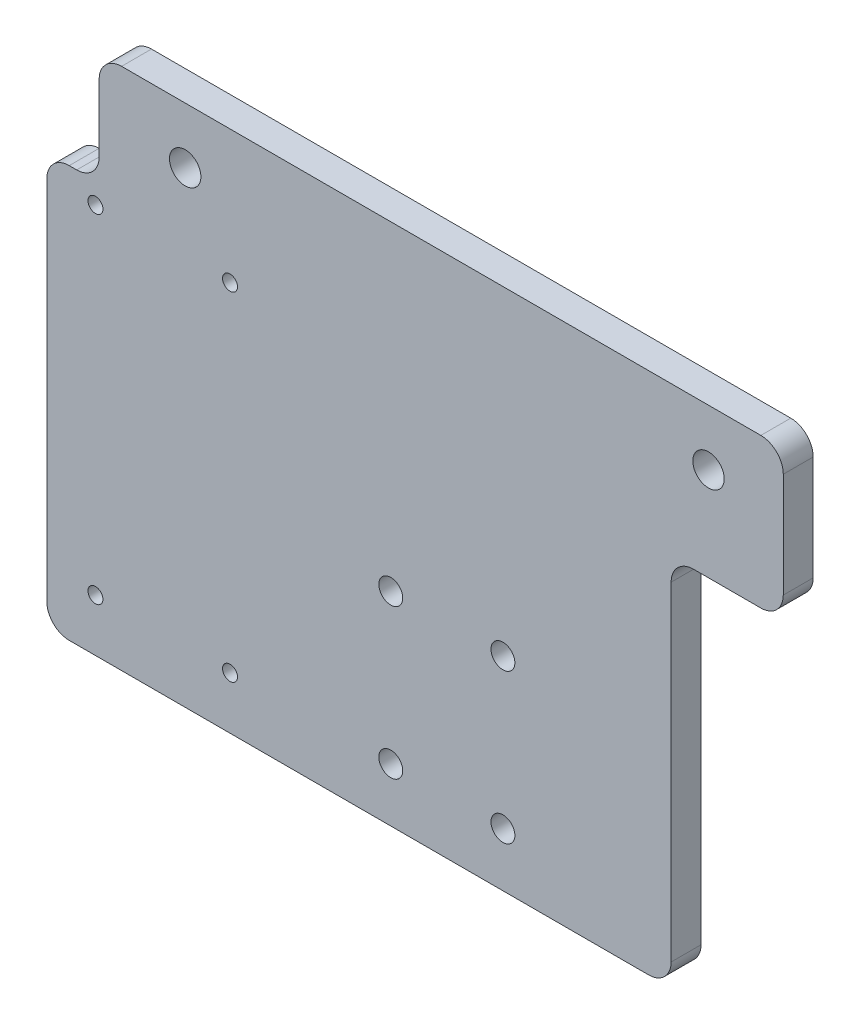
ISO-10303-21;
HEADER;
FILE_DESCRIPTION(('STEP AP214'),'2;1');
FILE_NAME('part.step','',(''),(''),'','','');
FILE_SCHEMA(('AUTOMOTIVE_DESIGN { 1 0 10303 214 1 1 1 1 }'));
ENDSEC;
DATA;
#1=APPLICATION_CONTEXT('core data for automotive mechanical design processes');
#2=APPLICATION_PROTOCOL_DEFINITION('international standard','automotive_design',2000,#1);
#3=PRODUCT_CONTEXT('',#1,'mechanical');
#4=PRODUCT('Part','Part','',(#3));
#5=PRODUCT_RELATED_PRODUCT_CATEGORY('part','',(#4));
#6=PRODUCT_DEFINITION_FORMATION('','',#4);
#7=PRODUCT_DEFINITION_CONTEXT('part definition',#1,'design');
#8=PRODUCT_DEFINITION('design','',#6,#7);
#9=PRODUCT_DEFINITION_SHAPE('','',#8);
#10=(LENGTH_UNIT() NAMED_UNIT(*) SI_UNIT(.MILLI.,.METRE.));
#11=(NAMED_UNIT(*) PLANE_ANGLE_UNIT() SI_UNIT($,.RADIAN.));
#12=(NAMED_UNIT(*) SI_UNIT($,.STERADIAN.) SOLID_ANGLE_UNIT());
#13=UNCERTAINTY_MEASURE_WITH_UNIT(LENGTH_MEASURE(1.E-05),#10,'distance_accuracy_value','');
#14=(GEOMETRIC_REPRESENTATION_CONTEXT(3) GLOBAL_UNCERTAINTY_ASSIGNED_CONTEXT((#13)) GLOBAL_UNIT_ASSIGNED_CONTEXT((#10,
#11,#12)) REPRESENTATION_CONTEXT('',''));
#15=CARTESIAN_POINT('',(0.,0.,0.));
#16=DIRECTION('',(0.,0.,1.));
#17=DIRECTION('',(1.,0.,0.));
#18=AXIS2_PLACEMENT_3D('',#15,#16,#17);
#19=CARTESIAN_POINT('',(0.,0.,4.));
#20=DIRECTION('',(0.,0.,1.));
#21=DIRECTION('',(1.,0.,0.));
#22=AXIS2_PLACEMENT_3D('',#19,#20,#21);
#23=PLANE('',#22);
#24=CARTESIAN_POINT('',(7.50000000000021,22.2,4.));
#25=DIRECTION('',(0.,0.,1.));
#26=DIRECTION('',(1.,0.,0.));
#27=AXIS2_PLACEMENT_3D('',#24,#25,#26);
#28=CIRCLE('',#27,1.6);
#29=CARTESIAN_POINT('',(9.10000000000021,22.2,4.));
#30=VERTEX_POINT('',#29);
#31=EDGE_CURVE('E500',#30,#30,#28,.F.);
#32=ORIENTED_EDGE('',*,*,#31,.T.);
#33=EDGE_LOOP('',(#32));
#34=FACE_BOUND('',#33,.T.);
#35=CARTESIAN_POINT('',(-7.5,42.2,4.));
#36=DIRECTION('',(0.,0.,1.));
#37=DIRECTION('',(1.,0.,0.));
#38=AXIS2_PLACEMENT_3D('',#35,#36,#37);
#39=CIRCLE('',#38,1.60000000000001);
#40=CARTESIAN_POINT('',(-5.89999999999999,42.2,4.));
#41=VERTEX_POINT('',#40);
#42=EDGE_CURVE('E207',#41,#41,#39,.T.);
#43=ORIENTED_EDGE('',*,*,#42,.F.);
#44=EDGE_LOOP('',(#43));
#45=FACE_BOUND('',#44,.T.);
#46=DIRECTION('',(1.,0.,0.));
#47=VECTOR('',#46,1.);
#48=CARTESIAN_POINT('',(0.,70.,4.));
#49=LINE('',#48,#47);
#50=CARTESIAN_POINT('',(-50.5071624673069,70.,4.));
#51=VERTEX_POINT('',#50);
#52=CARTESIAN_POINT('',(-49.5071624673069,70.,4.));
#53=VERTEX_POINT('',#52);
#54=EDGE_CURVE('E187',#51,#53,#49,.T.);
#55=ORIENTED_EDGE('',*,*,#54,.F.);
#56=CARTESIAN_POINT('',(-50.5071624673069,67.,4.));
#57=DIRECTION('',(0.,0.,1.));
#58=DIRECTION('',(1.,0.,0.));
#59=AXIS2_PLACEMENT_3D('',#56,#57,#58);
#60=CIRCLE('',#59,3.);
#61=CARTESIAN_POINT('',(-53.5071624673069,67.,4.));
#62=VERTEX_POINT('',#61);
#63=EDGE_CURVE('E170',#51,#62,#60,.T.);
#64=ORIENTED_EDGE('',*,*,#63,.T.);
#65=DIRECTION('',(0.,1.,0.));
#66=VECTOR('',#65,1.);
#67=CARTESIAN_POINT('',(-53.5071624673069,0.,4.));
#68=LINE('',#67,#66);
#69=CARTESIAN_POINT('',(-53.5071624673069,18.,4.));
#70=VERTEX_POINT('',#69);
#71=EDGE_CURVE('E201',#70,#62,#68,.T.);
#72=ORIENTED_EDGE('',*,*,#71,.F.);
#73=CARTESIAN_POINT('',(-50.5071624673069,18.,4.));
#74=DIRECTION('',(0.,0.,1.));
#75=DIRECTION('',(1.,0.,0.));
#76=AXIS2_PLACEMENT_3D('',#73,#74,#75);
#77=CIRCLE('',#76,3.);
#78=CARTESIAN_POINT('',(-50.5071624673069,15.,4.));
#79=VERTEX_POINT('',#78);
#80=EDGE_CURVE('E281',#70,#79,#77,.T.);
#81=ORIENTED_EDGE('',*,*,#80,.T.);
#82=DIRECTION('',(-1.,0.,0.));
#83=VECTOR('',#82,1.);
#84=CARTESIAN_POINT('',(0.,15.,4.));
#85=LINE('',#84,#83);
#86=CARTESIAN_POINT('',(27.,15.,4.));
#87=VERTEX_POINT('',#86);
#88=EDGE_CURVE('E224',#87,#79,#85,.T.);
#89=ORIENTED_EDGE('',*,*,#88,.F.);
#90=CARTESIAN_POINT('',(27.,18.,4.));
#91=DIRECTION('',(0.,0.,1.));
#92=DIRECTION('',(1.,0.,0.));
#93=AXIS2_PLACEMENT_3D('',#90,#91,#92);
#94=CIRCLE('',#93,3.);
#95=CARTESIAN_POINT('',(30.,18.,4.));
#96=VERTEX_POINT('',#95);
#97=EDGE_CURVE('E191',#87,#96,#94,.T.);
#98=ORIENTED_EDGE('',*,*,#97,.T.);
#99=DIRECTION('',(0.,1.,0.));
#100=VECTOR('',#99,1.);
#101=CARTESIAN_POINT('',(30.,0.,4.));
#102=LINE('',#101,#100);
#103=CARTESIAN_POINT('',(30.,62.,4.));
#104=VERTEX_POINT('',#103);
#105=EDGE_CURVE('E204',#96,#104,#102,.T.);
#106=ORIENTED_EDGE('',*,*,#105,.T.);
#107=CARTESIAN_POINT('',(33.,62.,4.));
#108=DIRECTION('',(0.,0.,1.));
#109=DIRECTION('',(1.,0.,0.));
#110=AXIS2_PLACEMENT_3D('',#107,#108,#109);
#111=CIRCLE('',#110,3.);
#112=CARTESIAN_POINT('',(33.,65.,4.));
#113=VERTEX_POINT('',#112);
#114=EDGE_CURVE('E334',#104,#113,#111,.F.);
#115=ORIENTED_EDGE('',*,*,#114,.T.);
#116=DIRECTION('',(-1.,0.,0.));
#117=VECTOR('',#116,1.);
#118=CARTESIAN_POINT('',(0.,65.,4.));
#119=LINE('',#118,#117);
#120=CARTESIAN_POINT('',(42.,65.,4.));
#121=VERTEX_POINT('',#120);
#122=EDGE_CURVE('E198',#121,#113,#119,.T.);
#123=ORIENTED_EDGE('',*,*,#122,.F.);
#124=CARTESIAN_POINT('',(42.,68.,4.));
#125=DIRECTION('',(0.,0.,1.));
#126=DIRECTION('',(1.,0.,0.));
#127=AXIS2_PLACEMENT_3D('',#124,#125,#126);
#128=CIRCLE('',#127,3.);
#129=CARTESIAN_POINT('',(45.,68.,4.));
#130=VERTEX_POINT('',#129);
#131=EDGE_CURVE('E283',#121,#130,#128,.T.);
#132=ORIENTED_EDGE('',*,*,#131,.T.);
#133=DIRECTION('',(0.,-1.,0.));
#134=VECTOR('',#133,1.);
#135=CARTESIAN_POINT('',(45.,67.,4.));
#136=LINE('',#135,#134);
#137=CARTESIAN_POINT('',(45.,82.,4.));
#138=VERTEX_POINT('',#137);
#139=EDGE_CURVE('E243',#138,#130,#136,.T.);
#140=ORIENTED_EDGE('',*,*,#139,.F.);
#141=CARTESIAN_POINT('',(42.,82.,4.));
#142=DIRECTION('',(0.,0.,1.));
#143=DIRECTION('',(1.,0.,0.));
#144=AXIS2_PLACEMENT_3D('',#141,#142,#143);
#145=CIRCLE('',#144,3.);
#146=CARTESIAN_POINT('',(42.,85.,4.));
#147=VERTEX_POINT('',#146);
#148=EDGE_CURVE('E285',#138,#147,#145,.T.);
#149=ORIENTED_EDGE('',*,*,#148,.T.);
#150=DIRECTION('',(1.,0.,0.));
#151=VECTOR('',#150,1.);
#152=CARTESIAN_POINT('',(0.,85.,4.));
#153=LINE('',#152,#151);
#154=CARTESIAN_POINT('',(-43.5071624673069,85.,4.));
#155=VERTEX_POINT('',#154);
#156=EDGE_CURVE('E246',#155,#147,#153,.T.);
#157=ORIENTED_EDGE('',*,*,#156,.F.);
#158=CARTESIAN_POINT('',(-43.5071624673069,82.,4.));
#159=DIRECTION('',(0.,0.,1.));
#160=DIRECTION('',(1.,0.,0.));
#161=AXIS2_PLACEMENT_3D('',#158,#159,#160);
#162=CIRCLE('',#161,3.);
#163=CARTESIAN_POINT('',(-46.5071624673069,82.,4.));
#164=VERTEX_POINT('',#163);
#165=EDGE_CURVE('E181',#155,#164,#162,.T.);
#166=ORIENTED_EDGE('',*,*,#165,.T.);
#167=DIRECTION('',(0.,1.,0.));
#168=VECTOR('',#167,1.);
#169=CARTESIAN_POINT('',(-46.5071624673069,0.,4.));
#170=LINE('',#169,#168);
#171=CARTESIAN_POINT('',(-46.5071624673069,73.,4.));
#172=VERTEX_POINT('',#171);
#173=EDGE_CURVE('E197',#172,#164,#170,.T.);
#174=ORIENTED_EDGE('',*,*,#173,.F.);
#175=CARTESIAN_POINT('',(-49.5071624673069,73.,4.));
#176=DIRECTION('',(0.,0.,1.));
#177=DIRECTION('',(1.,0.,0.));
#178=AXIS2_PLACEMENT_3D('',#175,#176,#177);
#179=CIRCLE('',#178,3.);
#180=EDGE_CURVE('E196',#172,#53,#179,.F.);
#181=ORIENTED_EDGE('',*,*,#180,.T.);
#182=EDGE_LOOP('',(#55,#64,#72,#81,#89,#98,#106,#115,#123,#132,#140,#149,#157,#166,#174,#181));
#183=FACE_BOUND('',#182,.T.);
#184=CARTESIAN_POINT('',(-29.,22.,4.));
#185=DIRECTION('',(0.,0.,1.));
#186=DIRECTION('',(1.,0.,0.));
#187=AXIS2_PLACEMENT_3D('',#184,#185,#186);
#188=CIRCLE('',#187,0.999999999999998);
#189=CARTESIAN_POINT('',(-28.,22.,4.));
#190=VERTEX_POINT('',#189);
#191=EDGE_CURVE('E234',#190,#190,#188,.T.);
#192=ORIENTED_EDGE('',*,*,#191,.F.);
#193=EDGE_LOOP('',(#192));
#194=FACE_BOUND('',#193,.T.);
#195=CARTESIAN_POINT('',(-47.0000000000001,67.2,4.));
#196=DIRECTION('',(0.,0.,1.));
#197=DIRECTION('',(1.,0.,0.));
#198=AXIS2_PLACEMENT_3D('',#195,#196,#197);
#199=CIRCLE('',#198,0.999999999999998);
#200=CARTESIAN_POINT('',(-46.0000000000001,67.2,4.));
#201=VERTEX_POINT('',#200);
#202=EDGE_CURVE('E233',#201,#201,#199,.T.);
#203=ORIENTED_EDGE('',*,*,#202,.F.);
#204=EDGE_LOOP('',(#203));
#205=FACE_BOUND('',#204,.T.);
#206=CARTESIAN_POINT('',(-29.0000000000001,67.2,4.));
#207=DIRECTION('',(0.,0.,1.));
#208=DIRECTION('',(1.,0.,0.));
#209=AXIS2_PLACEMENT_3D('',#206,#207,#208);
#210=CIRCLE('',#209,0.999999999999998);
#211=CARTESIAN_POINT('',(-28.0000000000001,67.2,4.));
#212=VERTEX_POINT('',#211);
#213=EDGE_CURVE('E230',#212,#212,#210,.T.);
#214=ORIENTED_EDGE('',*,*,#213,.F.);
#215=EDGE_LOOP('',(#214));
#216=FACE_BOUND('',#215,.T.);
#217=CARTESIAN_POINT('',(-47.,22.,4.));
#218=DIRECTION('',(0.,0.,1.));
#219=DIRECTION('',(1.,0.,0.));
#220=AXIS2_PLACEMENT_3D('',#217,#218,#219);
#221=CIRCLE('',#220,0.999999999999998);
#222=CARTESIAN_POINT('',(-46.,22.,4.));
#223=VERTEX_POINT('',#222);
#224=EDGE_CURVE('E237',#223,#223,#221,.T.);
#225=ORIENTED_EDGE('',*,*,#224,.F.);
#226=EDGE_LOOP('',(#225));
#227=FACE_BOUND('',#226,.T.);
#228=CARTESIAN_POINT('',(-34.9999999999999,77.5,4.));
#229=DIRECTION('',(0.,0.,1.));
#230=DIRECTION('',(1.,0.,0.));
#231=AXIS2_PLACEMENT_3D('',#228,#229,#230);
#232=CIRCLE('',#231,2.1);
#233=CARTESIAN_POINT('',(-32.8999999999999,77.5,4.));
#234=VERTEX_POINT('',#233);
#235=EDGE_CURVE('E263',#234,#234,#232,.T.);
#236=ORIENTED_EDGE('',*,*,#235,.F.);
#237=EDGE_LOOP('',(#236));
#238=FACE_BOUND('',#237,.T.);
#239=CARTESIAN_POINT('',(35.0000000000001,77.5,4.));
#240=DIRECTION('',(0.,0.,1.));
#241=DIRECTION('',(1.,0.,0.));
#242=AXIS2_PLACEMENT_3D('',#239,#240,#241);
#243=CIRCLE('',#242,2.10000000000001);
#244=CARTESIAN_POINT('',(37.1000000000001,77.5,4.));
#245=VERTEX_POINT('',#244);
#246=EDGE_CURVE('E255',#245,#245,#243,.F.);
#247=ORIENTED_EDGE('',*,*,#246,.T.);
#248=EDGE_LOOP('',(#247));
#249=FACE_BOUND('',#248,.T.);
#250=CARTESIAN_POINT('',(-7.49999999999979,22.2,4.));
#251=DIRECTION('',(0.,0.,1.));
#252=DIRECTION('',(1.,0.,0.));
#253=AXIS2_PLACEMENT_3D('',#250,#251,#252);
#254=CIRCLE('',#253,1.6);
#255=CARTESIAN_POINT('',(-5.89999999999978,22.2,4.));
#256=VERTEX_POINT('',#255);
#257=EDGE_CURVE('E494',#256,#256,#254,.T.);
#258=ORIENTED_EDGE('',*,*,#257,.F.);
#259=EDGE_LOOP('',(#258));
#260=FACE_BOUND('',#259,.T.);
#261=CARTESIAN_POINT('',(7.5,42.2,4.));
#262=DIRECTION('',(0.,0.,1.));
#263=DIRECTION('',(1.,0.,0.));
#264=AXIS2_PLACEMENT_3D('',#261,#262,#263);
#265=CIRCLE('',#264,1.6);
#266=CARTESIAN_POINT('',(9.10000000000001,42.2,4.));
#267=VERTEX_POINT('',#266);
#268=EDGE_CURVE('E497',#267,#267,#265,.F.);
#269=ORIENTED_EDGE('',*,*,#268,.T.);
#270=EDGE_LOOP('',(#269));
#271=FACE_BOUND('',#270,.T.);
#272=ADVANCED_FACE('F53',(#34,#45,#183,#194,#205,#216,#227,#238,#249,#260,#271),#23,.T.);
#273=CARTESIAN_POINT('',(0.,0.,0.));
#274=DIRECTION('',(0.,0.,1.));
#275=DIRECTION('',(1.,0.,0.));
#276=AXIS2_PLACEMENT_3D('',#273,#274,#275);
#277=PLANE('',#276);
#278=CARTESIAN_POINT('',(-7.5,42.2,0.));
#279=DIRECTION('',(0.,0.,1.));
#280=DIRECTION('',(1.,0.,0.));
#281=AXIS2_PLACEMENT_3D('',#278,#279,#280);
#282=CIRCLE('',#281,2.60000000000001);
#283=CARTESIAN_POINT('',(-4.89999999999999,42.2,0.));
#284=VERTEX_POINT('',#283);
#285=EDGE_CURVE('E62',#284,#284,#282,.T.);
#286=ORIENTED_EDGE('',*,*,#285,.T.);
#287=EDGE_LOOP('',(#286));
#288=FACE_BOUND('',#287,.T.);
#289=CARTESIAN_POINT('',(-7.49999999999979,22.2,0.));
#290=DIRECTION('',(0.,0.,1.));
#291=DIRECTION('',(1.,0.,0.));
#292=AXIS2_PLACEMENT_3D('',#289,#290,#291);
#293=CIRCLE('',#292,1.6);
#294=CARTESIAN_POINT('',(-5.89999999999978,22.2,0.));
#295=VERTEX_POINT('',#294);
#296=EDGE_CURVE('E340',#295,#295,#293,.T.);
#297=ORIENTED_EDGE('',*,*,#296,.T.);
#298=EDGE_LOOP('',(#297));
#299=FACE_BOUND('',#298,.T.);
#300=CARTESIAN_POINT('',(35.0000000000001,77.5,0.));
#301=DIRECTION('',(0.,0.,1.));
#302=DIRECTION('',(1.,0.,0.));
#303=AXIS2_PLACEMENT_3D('',#300,#301,#302);
#304=CIRCLE('',#303,2.10000000000001);
#305=CARTESIAN_POINT('',(37.1000000000001,77.5,0.));
#306=VERTEX_POINT('',#305);
#307=EDGE_CURVE('E258',#306,#306,#304,.F.);
#308=ORIENTED_EDGE('',*,*,#307,.F.);
#309=EDGE_LOOP('',(#308));
#310=FACE_BOUND('',#309,.T.);
#311=CARTESIAN_POINT('',(-34.9999999999999,77.5,0.));
#312=DIRECTION('',(0.,0.,1.));
#313=DIRECTION('',(1.,0.,0.));
#314=AXIS2_PLACEMENT_3D('',#311,#312,#313);
#315=CIRCLE('',#314,2.1);
#316=CARTESIAN_POINT('',(-32.8999999999999,77.5,0.));
#317=VERTEX_POINT('',#316);
#318=EDGE_CURVE('E254',#317,#317,#315,.T.);
#319=ORIENTED_EDGE('',*,*,#318,.T.);
#320=EDGE_LOOP('',(#319));
#321=FACE_BOUND('',#320,.T.);
#322=CARTESIAN_POINT('',(-47.,22.,0.));
#323=DIRECTION('',(0.,0.,1.));
#324=DIRECTION('',(1.,0.,0.));
#325=AXIS2_PLACEMENT_3D('',#322,#323,#324);
#326=CIRCLE('',#325,0.999999999999998);
#327=CARTESIAN_POINT('',(-46.,22.,0.));
#328=VERTEX_POINT('',#327);
#329=EDGE_CURVE('E242',#328,#328,#326,.T.);
#330=ORIENTED_EDGE('',*,*,#329,.T.);
#331=EDGE_LOOP('',(#330));
#332=FACE_BOUND('',#331,.T.);
#333=CARTESIAN_POINT('',(-29.0000000000001,67.2,0.));
#334=DIRECTION('',(0.,0.,1.));
#335=DIRECTION('',(1.,0.,0.));
#336=AXIS2_PLACEMENT_3D('',#333,#334,#335);
#337=CIRCLE('',#336,0.999999999999998);
#338=CARTESIAN_POINT('',(-28.0000000000001,67.2,0.));
#339=VERTEX_POINT('',#338);
#340=EDGE_CURVE('E270',#339,#339,#337,.T.);
#341=ORIENTED_EDGE('',*,*,#340,.T.);
#342=EDGE_LOOP('',(#341));
#343=FACE_BOUND('',#342,.T.);
#344=CARTESIAN_POINT('',(-47.0000000000001,67.2,0.));
#345=DIRECTION('',(0.,0.,1.));
#346=DIRECTION('',(1.,0.,0.));
#347=AXIS2_PLACEMENT_3D('',#344,#345,#346);
#348=CIRCLE('',#347,0.999999999999998);
#349=CARTESIAN_POINT('',(-46.0000000000001,67.2,0.));
#350=VERTEX_POINT('',#349);
#351=EDGE_CURVE('E273',#350,#350,#348,.T.);
#352=ORIENTED_EDGE('',*,*,#351,.T.);
#353=EDGE_LOOP('',(#352));
#354=FACE_BOUND('',#353,.T.);
#355=CARTESIAN_POINT('',(-29.,22.,0.));
#356=DIRECTION('',(0.,0.,1.));
#357=DIRECTION('',(1.,0.,0.));
#358=AXIS2_PLACEMENT_3D('',#355,#356,#357);
#359=CIRCLE('',#358,0.999999999999998);
#360=CARTESIAN_POINT('',(-28.,22.,0.));
#361=VERTEX_POINT('',#360);
#362=EDGE_CURVE('E250',#361,#361,#359,.T.);
#363=ORIENTED_EDGE('',*,*,#362,.T.);
#364=EDGE_LOOP('',(#363));
#365=FACE_BOUND('',#364,.T.);
#366=DIRECTION('',(0.,1.,0.));
#367=VECTOR('',#366,1.);
#368=CARTESIAN_POINT('',(-53.5071624673069,0.,0.));
#369=LINE('',#368,#367);
#370=CARTESIAN_POINT('',(-53.5071624673069,18.,0.));
#371=VERTEX_POINT('',#370);
#372=CARTESIAN_POINT('',(-53.5071624673069,67.,0.));
#373=VERTEX_POINT('',#372);
#374=EDGE_CURVE('E216',#371,#373,#369,.T.);
#375=ORIENTED_EDGE('',*,*,#374,.T.);
#376=CARTESIAN_POINT('',(-50.5071624673069,67.,0.));
#377=DIRECTION('',(0.,0.,1.));
#378=DIRECTION('',(1.,0.,0.));
#379=AXIS2_PLACEMENT_3D('',#376,#377,#378);
#380=CIRCLE('',#379,3.);
#381=CARTESIAN_POINT('',(-50.5071624673069,70.,0.));
#382=VERTEX_POINT('',#381);
#383=EDGE_CURVE('E300',#373,#382,#380,.F.);
#384=ORIENTED_EDGE('',*,*,#383,.T.);
#385=DIRECTION('',(1.,0.,0.));
#386=VECTOR('',#385,1.);
#387=CARTESIAN_POINT('',(0.,70.,0.));
#388=LINE('',#387,#386);
#389=CARTESIAN_POINT('',(-49.5071624673069,70.,0.));
#390=VERTEX_POINT('',#389);
#391=EDGE_CURVE('E190',#382,#390,#388,.T.);
#392=ORIENTED_EDGE('',*,*,#391,.T.);
#393=CARTESIAN_POINT('',(-49.5071624673069,73.,0.));
#394=DIRECTION('',(0.,0.,1.));
#395=DIRECTION('',(1.,0.,0.));
#396=AXIS2_PLACEMENT_3D('',#393,#394,#395);
#397=CIRCLE('',#396,3.);
#398=CARTESIAN_POINT('',(-46.5071624673069,73.,0.));
#399=VERTEX_POINT('',#398);
#400=EDGE_CURVE('E332',#390,#399,#397,.T.);
#401=ORIENTED_EDGE('',*,*,#400,.T.);
#402=DIRECTION('',(0.,1.,0.));
#403=VECTOR('',#402,1.);
#404=CARTESIAN_POINT('',(-46.5071624673069,0.,0.));
#405=LINE('',#404,#403);
#406=CARTESIAN_POINT('',(-46.5071624673069,82.,0.));
#407=VERTEX_POINT('',#406);
#408=EDGE_CURVE('E221',#399,#407,#405,.T.);
#409=ORIENTED_EDGE('',*,*,#408,.T.);
#410=CARTESIAN_POINT('',(-43.5071624673069,82.,0.));
#411=DIRECTION('',(0.,0.,1.));
#412=DIRECTION('',(1.,0.,0.));
#413=AXIS2_PLACEMENT_3D('',#410,#411,#412);
#414=CIRCLE('',#413,3.);
#415=CARTESIAN_POINT('',(-43.5071624673069,85.,0.));
#416=VERTEX_POINT('',#415);
#417=EDGE_CURVE('E298',#407,#416,#414,.F.);
#418=ORIENTED_EDGE('',*,*,#417,.T.);
#419=DIRECTION('',(1.,0.,0.));
#420=VECTOR('',#419,1.);
#421=CARTESIAN_POINT('',(0.,85.,0.));
#422=LINE('',#421,#420);
#423=CARTESIAN_POINT('',(42.,85.,0.));
#424=VERTEX_POINT('',#423);
#425=EDGE_CURVE('E251',#416,#424,#422,.T.);
#426=ORIENTED_EDGE('',*,*,#425,.T.);
#427=CARTESIAN_POINT('',(42.,82.,0.));
#428=DIRECTION('',(0.,0.,1.));
#429=DIRECTION('',(1.,0.,0.));
#430=AXIS2_PLACEMENT_3D('',#427,#428,#429);
#431=CIRCLE('',#430,3.);
#432=CARTESIAN_POINT('',(45.,82.,0.));
#433=VERTEX_POINT('',#432);
#434=EDGE_CURVE('E296',#424,#433,#431,.F.);
#435=ORIENTED_EDGE('',*,*,#434,.T.);
#436=DIRECTION('',(0.,-1.,0.));
#437=VECTOR('',#436,1.);
#438=CARTESIAN_POINT('',(45.,67.,0.));
#439=LINE('',#438,#437);
#440=CARTESIAN_POINT('',(45.,68.,0.));
#441=VERTEX_POINT('',#440);
#442=EDGE_CURVE('E247',#433,#441,#439,.T.);
#443=ORIENTED_EDGE('',*,*,#442,.T.);
#444=CARTESIAN_POINT('',(42.,68.,0.));
#445=DIRECTION('',(0.,0.,1.));
#446=DIRECTION('',(1.,0.,0.));
#447=AXIS2_PLACEMENT_3D('',#444,#445,#446);
#448=CIRCLE('',#447,3.);
#449=CARTESIAN_POINT('',(42.,65.,0.));
#450=VERTEX_POINT('',#449);
#451=EDGE_CURVE('E294',#441,#450,#448,.F.);
#452=ORIENTED_EDGE('',*,*,#451,.T.);
#453=DIRECTION('',(-1.,0.,0.));
#454=VECTOR('',#453,1.);
#455=CARTESIAN_POINT('',(0.,65.,0.));
#456=LINE('',#455,#454);
#457=CARTESIAN_POINT('',(33.,65.,0.));
#458=VERTEX_POINT('',#457);
#459=EDGE_CURVE('E219',#450,#458,#456,.T.);
#460=ORIENTED_EDGE('',*,*,#459,.T.);
#461=CARTESIAN_POINT('',(33.,62.,0.));
#462=DIRECTION('',(0.,0.,1.));
#463=DIRECTION('',(1.,0.,0.));
#464=AXIS2_PLACEMENT_3D('',#461,#462,#463);
#465=CIRCLE('',#464,3.);
#466=CARTESIAN_POINT('',(30.,62.,0.));
#467=VERTEX_POINT('',#466);
#468=EDGE_CURVE('E69',#458,#467,#465,.T.);
#469=ORIENTED_EDGE('',*,*,#468,.T.);
#470=DIRECTION('',(0.,1.,0.));
#471=VECTOR('',#470,1.);
#472=CARTESIAN_POINT('',(30.,0.,0.));
#473=LINE('',#472,#471);
#474=CARTESIAN_POINT('',(30.,18.,0.));
#475=VERTEX_POINT('',#474);
#476=EDGE_CURVE('E211',#475,#467,#473,.T.);
#477=ORIENTED_EDGE('',*,*,#476,.F.);
#478=CARTESIAN_POINT('',(27.,18.,0.));
#479=DIRECTION('',(0.,0.,1.));
#480=DIRECTION('',(1.,0.,0.));
#481=AXIS2_PLACEMENT_3D('',#478,#479,#480);
#482=CIRCLE('',#481,3.);
#483=CARTESIAN_POINT('',(27.,15.,0.));
#484=VERTEX_POINT('',#483);
#485=EDGE_CURVE('E77',#475,#484,#482,.F.);
#486=ORIENTED_EDGE('',*,*,#485,.T.);
#487=DIRECTION('',(-1.,0.,0.));
#488=VECTOR('',#487,1.);
#489=CARTESIAN_POINT('',(0.,15.,0.));
#490=LINE('',#489,#488);
#491=CARTESIAN_POINT('',(-50.5071624673069,15.,0.));
#492=VERTEX_POINT('',#491);
#493=EDGE_CURVE('E227',#484,#492,#490,.T.);
#494=ORIENTED_EDGE('',*,*,#493,.T.);
#495=CARTESIAN_POINT('',(-50.5071624673069,18.,0.));
#496=DIRECTION('',(0.,0.,1.));
#497=DIRECTION('',(1.,0.,0.));
#498=AXIS2_PLACEMENT_3D('',#495,#496,#497);
#499=CIRCLE('',#498,3.);
#500=EDGE_CURVE('E292',#492,#371,#499,.F.);
#501=ORIENTED_EDGE('',*,*,#500,.T.);
#502=EDGE_LOOP('',(#375,#384,#392,#401,#409,#418,#426,#435,#443,#452,#460,#469,#477,#486,#494,#501));
#503=FACE_BOUND('',#502,.T.);
#504=CARTESIAN_POINT('',(7.50000000000021,22.2,0.));
#505=DIRECTION('',(0.,0.,1.));
#506=DIRECTION('',(1.,0.,0.));
#507=AXIS2_PLACEMENT_3D('',#504,#505,#506);
#508=CIRCLE('',#507,1.6);
#509=CARTESIAN_POINT('',(9.10000000000021,22.2,0.));
#510=VERTEX_POINT('',#509);
#511=EDGE_CURVE('E337',#510,#510,#508,.F.);
#512=ORIENTED_EDGE('',*,*,#511,.F.);
#513=EDGE_LOOP('',(#512));
#514=FACE_BOUND('',#513,.T.);
#515=CARTESIAN_POINT('',(7.5,42.2,0.));
#516=DIRECTION('',(0.,0.,1.));
#517=DIRECTION('',(1.,0.,0.));
#518=AXIS2_PLACEMENT_3D('',#515,#516,#517);
#519=CIRCLE('',#518,1.6);
#520=CARTESIAN_POINT('',(9.10000000000001,42.2,0.));
#521=VERTEX_POINT('',#520);
#522=EDGE_CURVE('E213',#521,#521,#519,.F.);
#523=ORIENTED_EDGE('',*,*,#522,.F.);
#524=EDGE_LOOP('',(#523));
#525=FACE_BOUND('',#524,.T.);
#526=ADVANCED_FACE('F347',(#288,#299,#310,#321,#332,#343,#354,#365,#503,#514,#525),#277,.F.);
#527=CARTESIAN_POINT('',(0.,15.,-6.));
#528=DIRECTION('',(0.,1.,0.));
#529=DIRECTION('',(0.,0.,1.));
#530=AXIS2_PLACEMENT_3D('',#527,#528,#529);
#531=PLANE('',#530);
#532=ORIENTED_EDGE('',*,*,#88,.T.);
#533=DIRECTION('',(0.,0.,1.));
#534=VECTOR('',#533,1.);
#535=CARTESIAN_POINT('',(-50.5071624673069,15.,-6.));
#536=LINE('',#535,#534);
#537=EDGE_CURVE('E329',#79,#492,#536,.F.);
#538=ORIENTED_EDGE('',*,*,#537,.T.);
#539=ORIENTED_EDGE('',*,*,#493,.F.);
#540=DIRECTION('',(0.,0.,-1.));
#541=VECTOR('',#540,1.);
#542=CARTESIAN_POINT('',(27.,15.,4.));
#543=LINE('',#542,#541);
#544=EDGE_CURVE('E327',#484,#87,#543,.F.);
#545=ORIENTED_EDGE('',*,*,#544,.T.);
#546=EDGE_LOOP('',(#532,#538,#539,#545));
#547=FACE_BOUND('',#546,.T.);
#548=ADVANCED_FACE('F369',(#547),#531,.F.);
#549=CARTESIAN_POINT('',(0.,85.,0.));
#550=DIRECTION('',(0.,-1.,0.));
#551=DIRECTION('',(0.,0.,-1.));
#552=AXIS2_PLACEMENT_3D('',#549,#550,#551);
#553=PLANE('',#552);
#554=ORIENTED_EDGE('',*,*,#425,.F.);
#555=DIRECTION('',(0.,0.,1.));
#556=VECTOR('',#555,1.);
#557=CARTESIAN_POINT('',(-43.5071624673069,85.,0.));
#558=LINE('',#557,#556);
#559=EDGE_CURVE('E309',#416,#155,#558,.T.);
#560=ORIENTED_EDGE('',*,*,#559,.T.);
#561=ORIENTED_EDGE('',*,*,#156,.T.);
#562=DIRECTION('',(0.,0.,1.));
#563=VECTOR('',#562,1.);
#564=CARTESIAN_POINT('',(42.,85.,0.));
#565=LINE('',#564,#563);
#566=EDGE_CURVE('E307',#147,#424,#565,.F.);
#567=ORIENTED_EDGE('',*,*,#566,.T.);
#568=EDGE_LOOP('',(#554,#560,#561,#567));
#569=FACE_BOUND('',#568,.T.);
#570=ADVANCED_FACE('F374',(#569),#553,.F.);
#571=CARTESIAN_POINT('',(45.,67.,0.));
#572=DIRECTION('',(-1.,0.,0.));
#573=DIRECTION('',(0.,-1.,0.));
#574=AXIS2_PLACEMENT_3D('',#571,#572,#573);
#575=PLANE('',#574);
#576=ORIENTED_EDGE('',*,*,#442,.F.);
#577=DIRECTION('',(0.,0.,1.));
#578=VECTOR('',#577,1.);
#579=CARTESIAN_POINT('',(45.,82.,0.));
#580=LINE('',#579,#578);
#581=EDGE_CURVE('E314',#433,#138,#580,.T.);
#582=ORIENTED_EDGE('',*,*,#581,.T.);
#583=ORIENTED_EDGE('',*,*,#139,.T.);
#584=DIRECTION('',(0.,0.,1.));
#585=VECTOR('',#584,1.);
#586=CARTESIAN_POINT('',(45.,68.,0.));
#587=LINE('',#586,#585);
#588=EDGE_CURVE('E312',#130,#441,#587,.F.);
#589=ORIENTED_EDGE('',*,*,#588,.T.);
#590=EDGE_LOOP('',(#576,#582,#583,#589));
#591=FACE_BOUND('',#590,.T.);
#592=ADVANCED_FACE('F427',(#591),#575,.F.);
#593=CARTESIAN_POINT('',(-34.9999999999999,77.5,0.));
#594=DIRECTION('',(0.,0.,1.));
#595=DIRECTION('',(1.,0.,0.));
#596=AXIS2_PLACEMENT_3D('',#593,#594,#595);
#597=CYLINDRICAL_SURFACE('',#596,2.1);
#598=ORIENTED_EDGE('',*,*,#318,.F.);
#599=EDGE_LOOP('',(#598));
#600=FACE_BOUND('',#599,.T.);
#601=ORIENTED_EDGE('',*,*,#235,.T.);
#602=EDGE_LOOP('',(#601));
#603=FACE_BOUND('',#602,.T.);
#604=ADVANCED_FACE('F477',(#600,#603),#597,.F.);
#605=CARTESIAN_POINT('',(35.0000000000001,77.5,0.));
#606=DIRECTION('',(0.,0.,1.));
#607=DIRECTION('',(1.,0.,0.));
#608=AXIS2_PLACEMENT_3D('',#605,#606,#607);
#609=CYLINDRICAL_SURFACE('',#608,2.10000000000001);
#610=ORIENTED_EDGE('',*,*,#307,.T.);
#611=EDGE_LOOP('',(#610));
#612=FACE_BOUND('',#611,.T.);
#613=ORIENTED_EDGE('',*,*,#246,.F.);
#614=EDGE_LOOP('',(#613));
#615=FACE_BOUND('',#614,.T.);
#616=ADVANCED_FACE('F473',(#612,#615),#609,.F.);
#617=CARTESIAN_POINT('',(-47.,22.,-6.));
#618=DIRECTION('',(0.,0.,1.));
#619=DIRECTION('',(1.,0.,0.));
#620=AXIS2_PLACEMENT_3D('',#617,#618,#619);
#621=CYLINDRICAL_SURFACE('',#620,0.999999999999998);
#622=ORIENTED_EDGE('',*,*,#224,.T.);
#623=EDGE_LOOP('',(#622));
#624=FACE_BOUND('',#623,.T.);
#625=ORIENTED_EDGE('',*,*,#329,.F.);
#626=EDGE_LOOP('',(#625));
#627=FACE_BOUND('',#626,.T.);
#628=ADVANCED_FACE('F463',(#624,#627),#621,.F.);
#629=CARTESIAN_POINT('',(-29.0000000000001,67.2,-6.));
#630=DIRECTION('',(0.,0.,1.));
#631=DIRECTION('',(1.,0.,0.));
#632=AXIS2_PLACEMENT_3D('',#629,#630,#631);
#633=CYLINDRICAL_SURFACE('',#632,0.999999999999998);
#634=ORIENTED_EDGE('',*,*,#213,.T.);
#635=EDGE_LOOP('',(#634));
#636=FACE_BOUND('',#635,.T.);
#637=ORIENTED_EDGE('',*,*,#340,.F.);
#638=EDGE_LOOP('',(#637));
#639=FACE_BOUND('',#638,.T.);
#640=ADVANCED_FACE('F459',(#636,#639),#633,.F.);
#641=CARTESIAN_POINT('',(-47.0000000000001,67.2,-6.));
#642=DIRECTION('',(0.,0.,1.));
#643=DIRECTION('',(1.,0.,0.));
#644=AXIS2_PLACEMENT_3D('',#641,#642,#643);
#645=CYLINDRICAL_SURFACE('',#644,0.999999999999998);
#646=ORIENTED_EDGE('',*,*,#202,.T.);
#647=EDGE_LOOP('',(#646));
#648=FACE_BOUND('',#647,.T.);
#649=ORIENTED_EDGE('',*,*,#351,.F.);
#650=EDGE_LOOP('',(#649));
#651=FACE_BOUND('',#650,.T.);
#652=ADVANCED_FACE('F462',(#648,#651),#645,.F.);
#653=CARTESIAN_POINT('',(-29.,22.,-6.));
#654=DIRECTION('',(0.,0.,1.));
#655=DIRECTION('',(1.,0.,0.));
#656=AXIS2_PLACEMENT_3D('',#653,#654,#655);
#657=CYLINDRICAL_SURFACE('',#656,0.999999999999998);
#658=ORIENTED_EDGE('',*,*,#191,.T.);
#659=EDGE_LOOP('',(#658));
#660=FACE_BOUND('',#659,.T.);
#661=ORIENTED_EDGE('',*,*,#362,.F.);
#662=EDGE_LOOP('',(#661));
#663=FACE_BOUND('',#662,.T.);
#664=ADVANCED_FACE('F465',(#660,#663),#657,.F.);
#665=CARTESIAN_POINT('',(0.,65.,-6.));
#666=DIRECTION('',(0.,1.,0.));
#667=DIRECTION('',(0.,0.,1.));
#668=AXIS2_PLACEMENT_3D('',#665,#666,#667);
#669=PLANE('',#668);
#670=ORIENTED_EDGE('',*,*,#459,.F.);
#671=DIRECTION('',(0.,0.,1.));
#672=VECTOR('',#671,1.);
#673=CARTESIAN_POINT('',(42.,65.,-6.));
#674=LINE('',#673,#672);
#675=EDGE_CURVE('E319',#450,#121,#674,.T.);
#676=ORIENTED_EDGE('',*,*,#675,.T.);
#677=ORIENTED_EDGE('',*,*,#122,.T.);
#678=DIRECTION('',(0.,0.,1.));
#679=VECTOR('',#678,1.);
#680=CARTESIAN_POINT('',(33.,65.,-6.));
#681=LINE('',#680,#679);
#682=EDGE_CURVE('E317',#113,#458,#681,.F.);
#683=ORIENTED_EDGE('',*,*,#682,.T.);
#684=EDGE_LOOP('',(#670,#676,#677,#683));
#685=FACE_BOUND('',#684,.T.);
#686=ADVANCED_FACE('F420',(#685),#669,.F.);
#687=CARTESIAN_POINT('',(30.,0.,-6.));
#688=DIRECTION('',(1.,0.,0.));
#689=DIRECTION('',(0.,0.,-1.));
#690=AXIS2_PLACEMENT_3D('',#687,#688,#689);
#691=PLANE('',#690);
#692=ORIENTED_EDGE('',*,*,#476,.T.);
#693=DIRECTION('',(0.,0.,1.));
#694=VECTOR('',#693,1.);
#695=CARTESIAN_POINT('',(30.,62.,-6.));
#696=LINE('',#695,#694);
#697=EDGE_CURVE('E324',#467,#104,#696,.T.);
#698=ORIENTED_EDGE('',*,*,#697,.T.);
#699=ORIENTED_EDGE('',*,*,#105,.F.);
#700=DIRECTION('',(0.,0.,-1.));
#701=VECTOR('',#700,1.);
#702=CARTESIAN_POINT('',(30.,18.,0.));
#703=LINE('',#702,#701);
#704=EDGE_CURVE('E322',#96,#475,#703,.T.);
#705=ORIENTED_EDGE('',*,*,#704,.T.);
#706=EDGE_LOOP('',(#692,#698,#699,#705));
#707=FACE_BOUND('',#706,.T.);
#708=ADVANCED_FACE('F414',(#707),#691,.T.);
#709=CARTESIAN_POINT('',(0.,70.,-6.));
#710=DIRECTION('',(0.,-1.,0.));
#711=DIRECTION('',(0.,0.,-1.));
#712=AXIS2_PLACEMENT_3D('',#709,#710,#711);
#713=PLANE('',#712);
#714=ORIENTED_EDGE('',*,*,#391,.F.);
#715=DIRECTION('',(0.,0.,1.));
#716=VECTOR('',#715,1.);
#717=CARTESIAN_POINT('',(-50.5071624673069,70.,-6.));
#718=LINE('',#717,#716);
#719=EDGE_CURVE('E174',#382,#51,#718,.T.);
#720=ORIENTED_EDGE('',*,*,#719,.T.);
#721=ORIENTED_EDGE('',*,*,#54,.T.);
#722=DIRECTION('',(0.,0.,1.));
#723=VECTOR('',#722,1.);
#724=CARTESIAN_POINT('',(-49.5071624673069,70.,0.));
#725=LINE('',#724,#723);
#726=EDGE_CURVE('E192',#53,#390,#725,.F.);
#727=ORIENTED_EDGE('',*,*,#726,.T.);
#728=EDGE_LOOP('',(#714,#720,#721,#727));
#729=FACE_BOUND('',#728,.T.);
#730=ADVANCED_FACE('F186',(#729),#713,.F.);
#731=CARTESIAN_POINT('',(-46.5071624673069,0.,-6.));
#732=DIRECTION('',(1.,0.,0.));
#733=DIRECTION('',(0.,0.,-1.));
#734=AXIS2_PLACEMENT_3D('',#731,#732,#733);
#735=PLANE('',#734);
#736=ORIENTED_EDGE('',*,*,#408,.F.);
#737=DIRECTION('',(0.,0.,1.));
#738=VECTOR('',#737,1.);
#739=CARTESIAN_POINT('',(-46.5071624673069,73.,4.));
#740=LINE('',#739,#738);
#741=EDGE_CURVE('E304',#399,#172,#740,.T.);
#742=ORIENTED_EDGE('',*,*,#741,.T.);
#743=ORIENTED_EDGE('',*,*,#173,.T.);
#744=DIRECTION('',(0.,0.,1.));
#745=VECTOR('',#744,1.);
#746=CARTESIAN_POINT('',(-46.5071624673069,82.,-6.));
#747=LINE('',#746,#745);
#748=EDGE_CURVE('E302',#164,#407,#747,.F.);
#749=ORIENTED_EDGE('',*,*,#748,.T.);
#750=EDGE_LOOP('',(#736,#742,#743,#749));
#751=FACE_BOUND('',#750,.T.);
#752=ADVANCED_FACE('F439',(#751),#735,.F.);
#753=CARTESIAN_POINT('',(-53.5071624673069,0.,-6.));
#754=DIRECTION('',(1.,0.,0.));
#755=DIRECTION('',(0.,0.,-1.));
#756=AXIS2_PLACEMENT_3D('',#753,#754,#755);
#757=PLANE('',#756);
#758=ORIENTED_EDGE('',*,*,#71,.T.);
#759=DIRECTION('',(0.,0.,1.));
#760=VECTOR('',#759,1.);
#761=CARTESIAN_POINT('',(-53.5071624673069,67.,-6.));
#762=LINE('',#761,#760);
#763=EDGE_CURVE('E175',#62,#373,#762,.F.);
#764=ORIENTED_EDGE('',*,*,#763,.T.);
#765=ORIENTED_EDGE('',*,*,#374,.F.);
#766=DIRECTION('',(0.,0.,1.));
#767=VECTOR('',#766,1.);
#768=CARTESIAN_POINT('',(-53.5071624673069,18.,-6.));
#769=LINE('',#768,#767);
#770=EDGE_CURVE('E180',#371,#70,#769,.T.);
#771=ORIENTED_EDGE('',*,*,#770,.T.);
#772=EDGE_LOOP('',(#758,#764,#765,#771));
#773=FACE_BOUND('',#772,.T.);
#774=ADVANCED_FACE('F380',(#773),#757,.F.);
#775=CARTESIAN_POINT('',(-50.5071624673069,67.,-6.));
#776=DIRECTION('',(0.,0.,1.));
#777=DIRECTION('',(1.,0.,0.));
#778=AXIS2_PLACEMENT_3D('',#775,#776,#777);
#779=CYLINDRICAL_SURFACE('',#778,3.);
#780=ORIENTED_EDGE('',*,*,#383,.F.);
#781=ORIENTED_EDGE('',*,*,#763,.F.);
#782=ORIENTED_EDGE('',*,*,#63,.F.);
#783=ORIENTED_EDGE('',*,*,#719,.F.);
#784=EDGE_LOOP('',(#780,#781,#782,#783));
#785=FACE_BOUND('',#784,.T.);
#786=ADVANCED_FACE('F173',(#785),#779,.T.);
#787=CARTESIAN_POINT('',(-49.5071624673069,73.,-6.));
#788=DIRECTION('',(0.,0.,-1.));
#789=DIRECTION('',(-1.,0.,0.));
#790=AXIS2_PLACEMENT_3D('',#787,#788,#789);
#791=CYLINDRICAL_SURFACE('',#790,3.);
#792=ORIENTED_EDGE('',*,*,#400,.F.);
#793=ORIENTED_EDGE('',*,*,#726,.F.);
#794=ORIENTED_EDGE('',*,*,#180,.F.);
#795=ORIENTED_EDGE('',*,*,#741,.F.);
#796=EDGE_LOOP('',(#792,#793,#794,#795));
#797=FACE_BOUND('',#796,.T.);
#798=ADVANCED_FACE('F379',(#797),#791,.F.);
#799=CARTESIAN_POINT('',(-43.5071624673069,82.,0.));
#800=DIRECTION('',(0.,0.,1.));
#801=DIRECTION('',(1.,0.,0.));
#802=AXIS2_PLACEMENT_3D('',#799,#800,#801);
#803=CYLINDRICAL_SURFACE('',#802,3.);
#804=ORIENTED_EDGE('',*,*,#417,.F.);
#805=ORIENTED_EDGE('',*,*,#748,.F.);
#806=ORIENTED_EDGE('',*,*,#165,.F.);
#807=ORIENTED_EDGE('',*,*,#559,.F.);
#808=EDGE_LOOP('',(#804,#805,#806,#807));
#809=FACE_BOUND('',#808,.T.);
#810=ADVANCED_FACE('F383',(#809),#803,.T.);
#811=CARTESIAN_POINT('',(42.,82.,0.));
#812=DIRECTION('',(0.,0.,1.));
#813=DIRECTION('',(1.,0.,0.));
#814=AXIS2_PLACEMENT_3D('',#811,#812,#813);
#815=CYLINDRICAL_SURFACE('',#814,3.);
#816=ORIENTED_EDGE('',*,*,#434,.F.);
#817=ORIENTED_EDGE('',*,*,#566,.F.);
#818=ORIENTED_EDGE('',*,*,#148,.F.);
#819=ORIENTED_EDGE('',*,*,#581,.F.);
#820=EDGE_LOOP('',(#816,#817,#818,#819));
#821=FACE_BOUND('',#820,.T.);
#822=ADVANCED_FACE('F387',(#821),#815,.T.);
#823=CARTESIAN_POINT('',(42.,68.,-6.));
#824=DIRECTION('',(0.,0.,1.));
#825=DIRECTION('',(1.,0.,0.));
#826=AXIS2_PLACEMENT_3D('',#823,#824,#825);
#827=CYLINDRICAL_SURFACE('',#826,3.);
#828=ORIENTED_EDGE('',*,*,#451,.F.);
#829=ORIENTED_EDGE('',*,*,#588,.F.);
#830=ORIENTED_EDGE('',*,*,#131,.F.);
#831=ORIENTED_EDGE('',*,*,#675,.F.);
#832=EDGE_LOOP('',(#828,#829,#830,#831));
#833=FACE_BOUND('',#832,.T.);
#834=ADVANCED_FACE('F391',(#833),#827,.T.);
#835=CARTESIAN_POINT('',(33.,62.,-6.));
#836=DIRECTION('',(0.,0.,1.));
#837=DIRECTION('',(1.,0.,0.));
#838=AXIS2_PLACEMENT_3D('',#835,#836,#837);
#839=CYLINDRICAL_SURFACE('',#838,3.);
#840=ORIENTED_EDGE('',*,*,#468,.F.);
#841=ORIENTED_EDGE('',*,*,#682,.F.);
#842=ORIENTED_EDGE('',*,*,#114,.F.);
#843=ORIENTED_EDGE('',*,*,#697,.F.);
#844=EDGE_LOOP('',(#840,#841,#842,#843));
#845=FACE_BOUND('',#844,.T.);
#846=ADVANCED_FACE('F395',(#845),#839,.F.);
#847=CARTESIAN_POINT('',(-50.5071624673069,18.,-6.));
#848=DIRECTION('',(0.,0.,1.));
#849=DIRECTION('',(1.,0.,0.));
#850=AXIS2_PLACEMENT_3D('',#847,#848,#849);
#851=CYLINDRICAL_SURFACE('',#850,3.);
#852=ORIENTED_EDGE('',*,*,#500,.F.);
#853=ORIENTED_EDGE('',*,*,#537,.F.);
#854=ORIENTED_EDGE('',*,*,#80,.F.);
#855=ORIENTED_EDGE('',*,*,#770,.F.);
#856=EDGE_LOOP('',(#852,#853,#854,#855));
#857=FACE_BOUND('',#856,.T.);
#858=ADVANCED_FACE('F399',(#857),#851,.T.);
#859=CARTESIAN_POINT('',(27.,18.,-6.));
#860=DIRECTION('',(0.,0.,1.));
#861=DIRECTION('',(1.,0.,0.));
#862=AXIS2_PLACEMENT_3D('',#859,#860,#861);
#863=CYLINDRICAL_SURFACE('',#862,3.);
#864=ORIENTED_EDGE('',*,*,#97,.F.);
#865=ORIENTED_EDGE('',*,*,#544,.F.);
#866=ORIENTED_EDGE('',*,*,#485,.F.);
#867=ORIENTED_EDGE('',*,*,#704,.F.);
#868=EDGE_LOOP('',(#864,#865,#866,#867));
#869=FACE_BOUND('',#868,.T.);
#870=ADVANCED_FACE('F402',(#869),#863,.T.);
#871=CARTESIAN_POINT('',(-7.5,42.2,-6.));
#872=DIRECTION('',(0.,0.,1.));
#873=DIRECTION('',(1.,0.,0.));
#874=AXIS2_PLACEMENT_3D('',#871,#872,#873);
#875=CYLINDRICAL_SURFACE('',#874,1.60000000000001);
#876=CARTESIAN_POINT('',(-7.5,42.2,1.00000000000002));
#877=DIRECTION('',(0.,0.,1.));
#878=DIRECTION('',(1.,0.,0.));
#879=AXIS2_PLACEMENT_3D('',#876,#877,#878);
#880=CIRCLE('',#879,1.60000000000001);
#881=CARTESIAN_POINT('',(-5.89999999999999,42.2,1.00000000000002));
#882=VERTEX_POINT('',#881);
#883=EDGE_CURVE('E11',#882,#882,#880,.F.);
#884=ORIENTED_EDGE('',*,*,#883,.T.);
#885=EDGE_LOOP('',(#884));
#886=FACE_BOUND('',#885,.T.);
#887=ORIENTED_EDGE('',*,*,#42,.T.);
#888=EDGE_LOOP('',(#887));
#889=FACE_BOUND('',#888,.T.);
#890=ADVANCED_FACE('F404',(#886,#889),#875,.F.);
#891=CARTESIAN_POINT('',(7.50000000000021,22.2,-6.));
#892=DIRECTION('',(0.,0.,1.));
#893=DIRECTION('',(1.,0.,0.));
#894=AXIS2_PLACEMENT_3D('',#891,#892,#893);
#895=CYLINDRICAL_SURFACE('',#894,1.6);
#896=ORIENTED_EDGE('',*,*,#31,.F.);
#897=EDGE_LOOP('',(#896));
#898=FACE_BOUND('',#897,.T.);
#899=ORIENTED_EDGE('',*,*,#511,.T.);
#900=EDGE_LOOP('',(#899));
#901=FACE_BOUND('',#900,.T.);
#902=ADVANCED_FACE('F407',(#898,#901),#895,.F.);
#903=CARTESIAN_POINT('',(-7.49999999999979,22.2,-6.));
#904=DIRECTION('',(0.,0.,1.));
#905=DIRECTION('',(1.,0.,0.));
#906=AXIS2_PLACEMENT_3D('',#903,#904,#905);
#907=CYLINDRICAL_SURFACE('',#906,1.6);
#908=ORIENTED_EDGE('',*,*,#257,.T.);
#909=EDGE_LOOP('',(#908));
#910=FACE_BOUND('',#909,.T.);
#911=ORIENTED_EDGE('',*,*,#296,.F.);
#912=EDGE_LOOP('',(#911));
#913=FACE_BOUND('',#912,.T.);
#914=ADVANCED_FACE('F357',(#910,#913),#907,.F.);
#915=CARTESIAN_POINT('',(7.5,42.2,-6.));
#916=DIRECTION('',(0.,0.,1.));
#917=DIRECTION('',(1.,0.,0.));
#918=AXIS2_PLACEMENT_3D('',#915,#916,#917);
#919=CYLINDRICAL_SURFACE('',#918,1.6);
#920=ORIENTED_EDGE('',*,*,#268,.F.);
#921=EDGE_LOOP('',(#920));
#922=FACE_BOUND('',#921,.T.);
#923=ORIENTED_EDGE('',*,*,#522,.T.);
#924=EDGE_LOOP('',(#923));
#925=FACE_BOUND('',#924,.T.);
#926=ADVANCED_FACE('F351',(#922,#925),#919,.F.);
#927=CARTESIAN_POINT('',(-7.5,42.2,0.));
#928=DIRECTION('',(0.,0.,-1.));
#929=DIRECTION('',(-1.,0.,0.));
#930=AXIS2_PLACEMENT_3D('',#927,#928,#929);
#931=CONICAL_SURFACE('',#930,2.60000000000001,0.785398163397438);
#932=ORIENTED_EDGE('',*,*,#883,.F.);
#933=EDGE_LOOP('',(#932));
#934=FACE_BOUND('',#933,.T.);
#935=ORIENTED_EDGE('',*,*,#285,.F.);
#936=EDGE_LOOP('',(#935));
#937=FACE_BOUND('',#936,.T.);
#938=ADVANCED_FACE('F56',(#934,#937),#931,.F.);
#939=CLOSED_SHELL('',(#272,#526,#548,#570,#592,#604,#616,#628,#640,#652,#664,#686,#708,#730,
#752,#774,#786,#798,#810,#822,#834,#846,#858,#870,#890,#902,#914,#926,#938));
#940=MANIFOLD_SOLID_BREP('B2',#939);
#941=ADVANCED_BREP_SHAPE_REPRESENTATION('',(#18,#940),#14);
#942=SHAPE_DEFINITION_REPRESENTATION(#9,#941);
ENDSEC;
END-ISO-10303-21;
